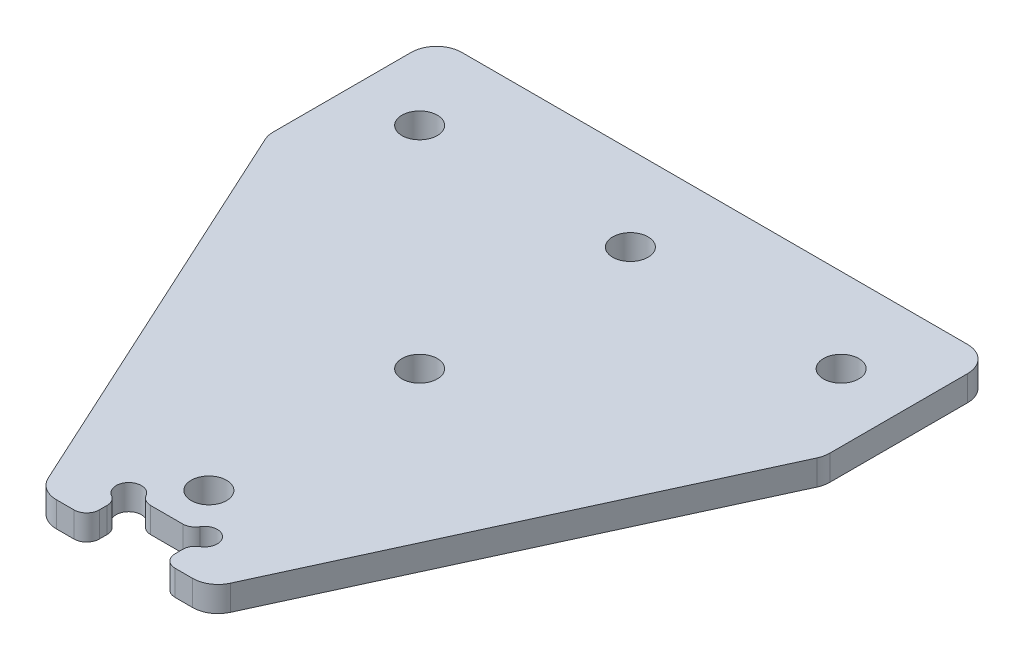
ISO-10303-21;
HEADER;
FILE_DESCRIPTION(('STEP AP214'),'2;1');
FILE_NAME('part.step','',(''),(''),'','','');
FILE_SCHEMA(('AUTOMOTIVE_DESIGN { 1 0 10303 214 1 1 1 1 }'));
ENDSEC;
DATA;
#1=APPLICATION_CONTEXT('core data for automotive mechanical design processes');
#2=APPLICATION_PROTOCOL_DEFINITION('international standard','automotive_design',2000,#1);
#3=PRODUCT_CONTEXT('',#1,'mechanical');
#4=PRODUCT('Part','Part','',(#3));
#5=PRODUCT_RELATED_PRODUCT_CATEGORY('part','',(#4));
#6=PRODUCT_DEFINITION_FORMATION('','',#4);
#7=PRODUCT_DEFINITION_CONTEXT('part definition',#1,'design');
#8=PRODUCT_DEFINITION('design','',#6,#7);
#9=PRODUCT_DEFINITION_SHAPE('','',#8);
#10=(LENGTH_UNIT() NAMED_UNIT(*) SI_UNIT(.MILLI.,.METRE.));
#11=(NAMED_UNIT(*) PLANE_ANGLE_UNIT() SI_UNIT($,.RADIAN.));
#12=(NAMED_UNIT(*) SI_UNIT($,.STERADIAN.) SOLID_ANGLE_UNIT());
#13=UNCERTAINTY_MEASURE_WITH_UNIT(LENGTH_MEASURE(1.E-05),#10,'distance_accuracy_value','');
#14=(GEOMETRIC_REPRESENTATION_CONTEXT(3) GLOBAL_UNCERTAINTY_ASSIGNED_CONTEXT((#13)) GLOBAL_UNIT_ASSIGNED_CONTEXT((#10,
#11,#12)) REPRESENTATION_CONTEXT('',''));
#15=CARTESIAN_POINT('',(0.,0.,0.));
#16=DIRECTION('',(0.,0.,1.));
#17=DIRECTION('',(1.,0.,0.));
#18=AXIS2_PLACEMENT_3D('',#15,#16,#17);
#19=CARTESIAN_POINT('',(0.,3.,60.));
#20=DIRECTION('',(0.,0.,-1.));
#21=DIRECTION('',(-1.,0.,0.));
#22=AXIS2_PLACEMENT_3D('',#19,#20,#21);
#23=PLANE('',#22);
#24=DIRECTION('',(1.,0.,0.));
#25=VECTOR('',#24,1.);
#26=CARTESIAN_POINT('',(0.,0.,60.));
#27=LINE('',#26,#25);
#28=CARTESIAN_POINT('',(-8.07781890260392,0.,60.));
#29=VERTEX_POINT('',#28);
#30=CARTESIAN_POINT('',(-6.,0.,60.));
#31=VERTEX_POINT('',#30);
#32=EDGE_CURVE('E412',#29,#31,#27,.T.);
#33=ORIENTED_EDGE('',*,*,#32,.T.);
#34=DIRECTION('',(0.,1.,0.));
#35=VECTOR('',#34,1.);
#36=CARTESIAN_POINT('',(-6.,3.,60.));
#37=LINE('',#36,#35);
#38=CARTESIAN_POINT('',(-6.,3.,60.));
#39=VERTEX_POINT('',#38);
#40=EDGE_CURVE('E11',#31,#39,#37,.T.);
#41=ORIENTED_EDGE('',*,*,#40,.T.);
#42=DIRECTION('',(1.,0.,0.));
#43=VECTOR('',#42,1.);
#44=CARTESIAN_POINT('',(0.,3.,60.));
#45=LINE('',#44,#43);
#46=CARTESIAN_POINT('',(-8.07781890260392,3.,60.));
#47=VERTEX_POINT('',#46);
#48=EDGE_CURVE('E388',#47,#39,#45,.T.);
#49=ORIENTED_EDGE('',*,*,#48,.F.);
#50=DIRECTION('',(0.,-1.,0.));
#51=VECTOR('',#50,1.);
#52=CARTESIAN_POINT('',(-8.07781890260392,3.,60.));
#53=LINE('',#52,#51);
#54=EDGE_CURVE('E251',#47,#29,#53,.T.);
#55=ORIENTED_EDGE('',*,*,#54,.T.);
#56=EDGE_LOOP('',(#33,#41,#49,#55));
#57=FACE_BOUND('',#56,.T.);
#58=ADVANCED_FACE('F41',(#57),#23,.F.);
#59=CARTESIAN_POINT('',(31.0333443380654,3.,14.2753383955101));
#60=DIRECTION('',(0.908490452678575,0.,0.417905608232144));
#61=DIRECTION('',(0.417905608232144,0.,-0.908490452678575));
#62=AXIS2_PLACEMENT_3D('',#59,#60,#61);
#63=PLANE('',#62);
#64=DIRECTION('',(-0.417905608232144,0.,0.908490452678575));
#65=VECTOR('',#64,1.);
#66=CARTESIAN_POINT('',(31.0333443380654,3.,14.2753383955101));
#67=LINE('',#66,#65);
#68=CARTESIAN_POINT('',(32.7254713580357,3.,10.5968013955745));
#69=VERTEX_POINT('',#68);
#70=CARTESIAN_POINT('',(10.8032902606396,3.,58.2537168246964));
#71=VERTEX_POINT('',#70);
#72=EDGE_CURVE('E373',#69,#71,#67,.T.);
#73=ORIENTED_EDGE('',*,*,#72,.T.);
#74=DIRECTION('',(0.,-1.,0.));
#75=VECTOR('',#74,1.);
#76=CARTESIAN_POINT('',(10.8032902606396,0.,58.2537168246964));
#77=LINE('',#76,#75);
#78=CARTESIAN_POINT('',(10.8032902606396,0.,58.2537168246964));
#79=VERTEX_POINT('',#78);
#80=EDGE_CURVE('E227',#71,#79,#77,.T.);
#81=ORIENTED_EDGE('',*,*,#80,.T.);
#82=DIRECTION('',(-0.417905608232144,0.,0.908490452678575));
#83=VECTOR('',#82,1.);
#84=CARTESIAN_POINT('',(31.0333443380654,0.,14.2753383955101));
#85=LINE('',#84,#83);
#86=CARTESIAN_POINT('',(32.7254713580357,0.,10.5968013955745));
#87=VERTEX_POINT('',#86);
#88=EDGE_CURVE('E210',#87,#79,#85,.T.);
#89=ORIENTED_EDGE('',*,*,#88,.F.);
#90=DIRECTION('',(0.,-1.,0.));
#91=VECTOR('',#90,1.);
#92=CARTESIAN_POINT('',(32.7254713580357,3.,10.5968013955745));
#93=LINE('',#92,#91);
#94=EDGE_CURVE('E224',#87,#69,#93,.F.);
#95=ORIENTED_EDGE('',*,*,#94,.T.);
#96=EDGE_LOOP('',(#73,#81,#89,#95));
#97=FACE_BOUND('',#96,.T.);
#98=ADVANCED_FACE('F223',(#97),#63,.T.);
#99=CARTESIAN_POINT('',(33.,3.,0.));
#100=DIRECTION('',(-1.,0.,0.));
#101=DIRECTION('',(0.,0.,1.));
#102=AXIS2_PLACEMENT_3D('',#99,#100,#101);
#103=PLANE('',#102);
#104=DIRECTION('',(0.,0.,-1.));
#105=VECTOR('',#104,1.);
#106=CARTESIAN_POINT('',(33.,3.,0.));
#107=LINE('',#106,#105);
#108=CARTESIAN_POINT('',(33.,3.,9.34308457087808));
#109=VERTEX_POINT('',#108);
#110=CARTESIAN_POINT('',(33.,3.,-7.));
#111=VERTEX_POINT('',#110);
#112=EDGE_CURVE('E375',#109,#111,#107,.T.);
#113=ORIENTED_EDGE('',*,*,#112,.F.);
#114=DIRECTION('',(0.,-1.,0.));
#115=VECTOR('',#114,1.);
#116=CARTESIAN_POINT('',(33.,0.,9.34308457087808));
#117=LINE('',#116,#115);
#118=CARTESIAN_POINT('',(33.,0.,9.34308457087808));
#119=VERTEX_POINT('',#118);
#120=EDGE_CURVE('E285',#109,#119,#117,.T.);
#121=ORIENTED_EDGE('',*,*,#120,.T.);
#122=DIRECTION('',(0.,0.,-1.));
#123=VECTOR('',#122,1.);
#124=CARTESIAN_POINT('',(33.,0.,0.));
#125=LINE('',#124,#123);
#126=CARTESIAN_POINT('',(33.,0.,-7.));
#127=VERTEX_POINT('',#126);
#128=EDGE_CURVE('E212',#119,#127,#125,.T.);
#129=ORIENTED_EDGE('',*,*,#128,.T.);
#130=DIRECTION('',(0.,-1.,0.));
#131=VECTOR('',#130,1.);
#132=CARTESIAN_POINT('',(33.,3.,-7.));
#133=LINE('',#132,#131);
#134=EDGE_CURVE('E283',#127,#111,#133,.F.);
#135=ORIENTED_EDGE('',*,*,#134,.T.);
#136=EDGE_LOOP('',(#113,#121,#129,#135));
#137=FACE_BOUND('',#136,.T.);
#138=ADVANCED_FACE('F453',(#137),#103,.F.);
#139=CARTESIAN_POINT('',(0.,3.,-10.));
#140=DIRECTION('',(0.,0.,1.));
#141=DIRECTION('',(1.,0.,0.));
#142=AXIS2_PLACEMENT_3D('',#139,#140,#141);
#143=PLANE('',#142);
#144=DIRECTION('',(-1.,0.,0.));
#145=VECTOR('',#144,1.);
#146=CARTESIAN_POINT('',(0.,0.,-10.));
#147=LINE('',#146,#145);
#148=CARTESIAN_POINT('',(30.,0.,-10.));
#149=VERTEX_POINT('',#148);
#150=CARTESIAN_POINT('',(-30.,0.,-10.));
#151=VERTEX_POINT('',#150);
#152=EDGE_CURVE('E402',#149,#151,#147,.T.);
#153=ORIENTED_EDGE('',*,*,#152,.T.);
#154=DIRECTION('',(0.,-1.,0.));
#155=VECTOR('',#154,1.);
#156=CARTESIAN_POINT('',(-30.,3.,-10.));
#157=LINE('',#156,#155);
#158=CARTESIAN_POINT('',(-30.,3.,-10.));
#159=VERTEX_POINT('',#158);
#160=EDGE_CURVE('E281',#151,#159,#157,.F.);
#161=ORIENTED_EDGE('',*,*,#160,.T.);
#162=DIRECTION('',(-1.,0.,0.));
#163=VECTOR('',#162,1.);
#164=CARTESIAN_POINT('',(0.,3.,-10.));
#165=LINE('',#164,#163);
#166=CARTESIAN_POINT('',(30.,3.,-10.));
#167=VERTEX_POINT('',#166);
#168=EDGE_CURVE('E378',#167,#159,#165,.T.);
#169=ORIENTED_EDGE('',*,*,#168,.F.);
#170=DIRECTION('',(0.,-1.,0.));
#171=VECTOR('',#170,1.);
#172=CARTESIAN_POINT('',(30.,3.,-10.));
#173=LINE('',#172,#171);
#174=EDGE_CURVE('E278',#167,#149,#173,.T.);
#175=ORIENTED_EDGE('',*,*,#174,.T.);
#176=EDGE_LOOP('',(#153,#161,#169,#175));
#177=FACE_BOUND('',#176,.T.);
#178=ADVANCED_FACE('F466',(#177),#143,.F.);
#179=CARTESIAN_POINT('',(-33.,3.,0.));
#180=DIRECTION('',(1.,0.,0.));
#181=DIRECTION('',(0.,0.,-1.));
#182=AXIS2_PLACEMENT_3D('',#179,#180,#181);
#183=PLANE('',#182);
#184=DIRECTION('',(0.,0.,1.));
#185=VECTOR('',#184,1.);
#186=CARTESIAN_POINT('',(-33.,0.,0.));
#187=LINE('',#186,#185);
#188=CARTESIAN_POINT('',(-33.,0.,-7.));
#189=VERTEX_POINT('',#188);
#190=CARTESIAN_POINT('',(-33.,0.,9.34308457087808));
#191=VERTEX_POINT('',#190);
#192=EDGE_CURVE('E405',#189,#191,#187,.T.);
#193=ORIENTED_EDGE('',*,*,#192,.T.);
#194=DIRECTION('',(0.,-1.,0.));
#195=VECTOR('',#194,1.);
#196=CARTESIAN_POINT('',(-33.,3.,9.34308457087808));
#197=LINE('',#196,#195);
#198=CARTESIAN_POINT('',(-33.,3.,9.34308457087808));
#199=VERTEX_POINT('',#198);
#200=EDGE_CURVE('E276',#191,#199,#197,.F.);
#201=ORIENTED_EDGE('',*,*,#200,.T.);
#202=DIRECTION('',(0.,0.,1.));
#203=VECTOR('',#202,1.);
#204=CARTESIAN_POINT('',(-33.,3.,0.));
#205=LINE('',#204,#203);
#206=CARTESIAN_POINT('',(-33.,3.,-7.));
#207=VERTEX_POINT('',#206);
#208=EDGE_CURVE('E381',#207,#199,#205,.T.);
#209=ORIENTED_EDGE('',*,*,#208,.F.);
#210=DIRECTION('',(0.,-1.,0.));
#211=VECTOR('',#210,1.);
#212=CARTESIAN_POINT('',(-33.,3.,-7.));
#213=LINE('',#212,#211);
#214=EDGE_CURVE('E273',#207,#189,#213,.T.);
#215=ORIENTED_EDGE('',*,*,#214,.T.);
#216=EDGE_LOOP('',(#193,#201,#209,#215));
#217=FACE_BOUND('',#216,.T.);
#218=ADVANCED_FACE('F462',(#217),#183,.F.);
#219=CARTESIAN_POINT('',(-31.0333443380654,3.,14.2753383955101));
#220=DIRECTION('',(0.908490452678575,0.,-0.417905608232144));
#221=DIRECTION('',(-0.417905608232144,0.,-0.908490452678575));
#222=AXIS2_PLACEMENT_3D('',#219,#220,#221);
#223=PLANE('',#222);
#224=DIRECTION('',(0.417905608232144,0.,0.908490452678575));
#225=VECTOR('',#224,1.);
#226=CARTESIAN_POINT('',(-31.0333443380654,0.,14.2753383955101));
#227=LINE('',#226,#225);
#228=CARTESIAN_POINT('',(-32.7254713580357,0.,10.5968013955745));
#229=VERTEX_POINT('',#228);
#230=CARTESIAN_POINT('',(-10.8032902606396,0.,58.2537168246964));
#231=VERTEX_POINT('',#230);
#232=EDGE_CURVE('E408',#229,#231,#227,.T.);
#233=ORIENTED_EDGE('',*,*,#232,.T.);
#234=DIRECTION('',(0.,-1.,0.));
#235=VECTOR('',#234,1.);
#236=CARTESIAN_POINT('',(-10.8032902606396,3.,58.2537168246964));
#237=LINE('',#236,#235);
#238=CARTESIAN_POINT('',(-10.8032902606396,3.,58.2537168246964));
#239=VERTEX_POINT('',#238);
#240=EDGE_CURVE('E271',#231,#239,#237,.F.);
#241=ORIENTED_EDGE('',*,*,#240,.T.);
#242=DIRECTION('',(0.417905608232144,0.,0.908490452678575));
#243=VECTOR('',#242,1.);
#244=CARTESIAN_POINT('',(-31.0333443380654,3.,14.2753383955101));
#245=LINE('',#244,#243);
#246=CARTESIAN_POINT('',(-32.7254713580357,3.,10.5968013955745));
#247=VERTEX_POINT('',#246);
#248=EDGE_CURVE('E384',#247,#239,#245,.T.);
#249=ORIENTED_EDGE('',*,*,#248,.F.);
#250=DIRECTION('',(0.,-1.,0.));
#251=VECTOR('',#250,1.);
#252=CARTESIAN_POINT('',(-32.7254713580357,3.,10.5968013955745));
#253=LINE('',#252,#251);
#254=EDGE_CURVE('E268',#247,#229,#253,.T.);
#255=ORIENTED_EDGE('',*,*,#254,.T.);
#256=EDGE_LOOP('',(#233,#241,#249,#255));
#257=FACE_BOUND('',#256,.T.);
#258=ADVANCED_FACE('F458',(#257),#223,.F.);
#259=CARTESIAN_POINT('',(25.,3.,0.));
#260=DIRECTION('',(0.,-1.,0.));
#261=DIRECTION('',(0.,0.,-1.));
#262=AXIS2_PLACEMENT_3D('',#259,#260,#261);
#263=CYLINDRICAL_SURFACE('',#262,2.1);
#264=CARTESIAN_POINT('',(25.,3.,0.));
#265=DIRECTION('',(0.,1.,0.));
#266=DIRECTION('',(0.,0.,1.));
#267=AXIS2_PLACEMENT_3D('',#264,#265,#266);
#268=CIRCLE('',#267,2.1);
#269=CARTESIAN_POINT('',(25.,3.,2.1));
#270=VERTEX_POINT('',#269);
#271=EDGE_CURVE('E237',#270,#270,#268,.T.);
#272=ORIENTED_EDGE('',*,*,#271,.T.);
#273=EDGE_LOOP('',(#272));
#274=FACE_BOUND('',#273,.T.);
#275=CARTESIAN_POINT('',(25.,0.,0.));
#276=DIRECTION('',(0.,1.,0.));
#277=DIRECTION('',(0.,0.,1.));
#278=AXIS2_PLACEMENT_3D('',#275,#276,#277);
#279=CIRCLE('',#278,2.1);
#280=CARTESIAN_POINT('',(25.,0.,2.1));
#281=VERTEX_POINT('',#280);
#282=EDGE_CURVE('E423',#281,#281,#279,.T.);
#283=ORIENTED_EDGE('',*,*,#282,.F.);
#284=EDGE_LOOP('',(#283));
#285=FACE_BOUND('',#284,.T.);
#286=ADVANCED_FACE('F461',(#274,#285),#263,.F.);
#287=CARTESIAN_POINT('',(-25.,3.,0.));
#288=DIRECTION('',(0.,-1.,0.));
#289=DIRECTION('',(0.,0.,-1.));
#290=AXIS2_PLACEMENT_3D('',#287,#288,#289);
#291=CYLINDRICAL_SURFACE('',#290,2.1);
#292=CARTESIAN_POINT('',(-25.,3.,0.));
#293=DIRECTION('',(0.,1.,0.));
#294=DIRECTION('',(0.,0.,1.));
#295=AXIS2_PLACEMENT_3D('',#292,#293,#294);
#296=CIRCLE('',#295,2.1);
#297=CARTESIAN_POINT('',(-25.,3.,2.1));
#298=VERTEX_POINT('',#297);
#299=EDGE_CURVE('E396',#298,#298,#296,.T.);
#300=ORIENTED_EDGE('',*,*,#299,.T.);
#301=EDGE_LOOP('',(#300));
#302=FACE_BOUND('',#301,.T.);
#303=CARTESIAN_POINT('',(-25.,0.,0.));
#304=DIRECTION('',(0.,1.,0.));
#305=DIRECTION('',(0.,0.,1.));
#306=AXIS2_PLACEMENT_3D('',#303,#304,#305);
#307=CIRCLE('',#306,2.1);
#308=CARTESIAN_POINT('',(-25.,0.,2.1));
#309=VERTEX_POINT('',#308);
#310=EDGE_CURVE('E421',#309,#309,#307,.T.);
#311=ORIENTED_EDGE('',*,*,#310,.F.);
#312=EDGE_LOOP('',(#311));
#313=FACE_BOUND('',#312,.T.);
#314=ADVANCED_FACE('F676',(#302,#313),#291,.F.);
#315=CARTESIAN_POINT('',(0.,3.,25.));
#316=DIRECTION('',(0.,-1.,0.));
#317=DIRECTION('',(0.,0.,-1.));
#318=AXIS2_PLACEMENT_3D('',#315,#316,#317);
#319=CYLINDRICAL_SURFACE('',#318,2.1);
#320=CARTESIAN_POINT('',(0.,3.,25.));
#321=DIRECTION('',(0.,1.,0.));
#322=DIRECTION('',(0.,0.,1.));
#323=AXIS2_PLACEMENT_3D('',#320,#321,#322);
#324=CIRCLE('',#323,2.1);
#325=CARTESIAN_POINT('',(0.,3.,27.1));
#326=VERTEX_POINT('',#325);
#327=EDGE_CURVE('E393',#326,#326,#324,.T.);
#328=ORIENTED_EDGE('',*,*,#327,.T.);
#329=EDGE_LOOP('',(#328));
#330=FACE_BOUND('',#329,.T.);
#331=CARTESIAN_POINT('',(0.,0.,25.));
#332=DIRECTION('',(0.,1.,0.));
#333=DIRECTION('',(0.,0.,1.));
#334=AXIS2_PLACEMENT_3D('',#331,#332,#333);
#335=CIRCLE('',#334,2.1);
#336=CARTESIAN_POINT('',(0.,0.,27.1));
#337=VERTEX_POINT('',#336);
#338=EDGE_CURVE('E418',#337,#337,#335,.T.);
#339=ORIENTED_EDGE('',*,*,#338,.F.);
#340=EDGE_LOOP('',(#339));
#341=FACE_BOUND('',#340,.T.);
#342=ADVANCED_FACE('F683',(#330,#341),#319,.F.);
#343=CARTESIAN_POINT('',(0.,3.,50.));
#344=DIRECTION('',(0.,-1.,0.));
#345=DIRECTION('',(0.,0.,-1.));
#346=AXIS2_PLACEMENT_3D('',#343,#344,#345);
#347=CYLINDRICAL_SURFACE('',#346,2.1);
#348=CARTESIAN_POINT('',(0.,3.,50.));
#349=DIRECTION('',(0.,1.,0.));
#350=DIRECTION('',(0.,0.,1.));
#351=AXIS2_PLACEMENT_3D('',#348,#349,#350);
#352=CIRCLE('',#351,2.1);
#353=CARTESIAN_POINT('',(0.,3.,52.1));
#354=VERTEX_POINT('',#353);
#355=EDGE_CURVE('E390',#354,#354,#352,.T.);
#356=ORIENTED_EDGE('',*,*,#355,.T.);
#357=EDGE_LOOP('',(#356));
#358=FACE_BOUND('',#357,.T.);
#359=CARTESIAN_POINT('',(0.,0.,50.));
#360=DIRECTION('',(0.,1.,0.));
#361=DIRECTION('',(0.,0.,1.));
#362=AXIS2_PLACEMENT_3D('',#359,#360,#361);
#363=CIRCLE('',#362,2.1);
#364=CARTESIAN_POINT('',(0.,0.,52.1));
#365=VERTEX_POINT('',#364);
#366=EDGE_CURVE('E415',#365,#365,#363,.T.);
#367=ORIENTED_EDGE('',*,*,#366,.F.);
#368=EDGE_LOOP('',(#367));
#369=FACE_BOUND('',#368,.T.);
#370=ADVANCED_FACE('F443',(#358,#369),#347,.F.);
#371=CARTESIAN_POINT('',(6.,3.,60.));
#372=VERTEX_POINT('',#371);
#373=CARTESIAN_POINT('',(8.07781890260393,3.,60.));
#374=VERTEX_POINT('',#373);
#375=EDGE_CURVE('E387',#372,#374,#45,.T.);
#376=ORIENTED_EDGE('',*,*,#375,.F.);
#377=DIRECTION('',(0.,1.,0.));
#378=VECTOR('',#377,1.);
#379=CARTESIAN_POINT('',(6.,3.,60.));
#380=LINE('',#379,#378);
#381=CARTESIAN_POINT('',(6.,0.,60.));
#382=VERTEX_POINT('',#381);
#383=EDGE_CURVE('E324',#372,#382,#380,.F.);
#384=ORIENTED_EDGE('',*,*,#383,.T.);
#385=CARTESIAN_POINT('',(8.07781890260393,0.,60.));
#386=VERTEX_POINT('',#385);
#387=EDGE_CURVE('E411',#382,#386,#27,.T.);
#388=ORIENTED_EDGE('',*,*,#387,.T.);
#389=DIRECTION('',(0.,-1.,0.));
#390=VECTOR('',#389,1.);
#391=CARTESIAN_POINT('',(8.07781890260393,3.,60.));
#392=LINE('',#391,#390);
#393=EDGE_CURVE('E254',#386,#374,#392,.F.);
#394=ORIENTED_EDGE('',*,*,#393,.T.);
#395=EDGE_LOOP('',(#376,#384,#388,#394));
#396=FACE_BOUND('',#395,.T.);
#397=ADVANCED_FACE('F433',(#396),#23,.F.);
#398=CARTESIAN_POINT('',(0.,3.,0.));
#399=DIRECTION('',(0.,-1.,0.));
#400=DIRECTION('',(0.,0.,-1.));
#401=AXIS2_PLACEMENT_3D('',#398,#399,#400);
#402=CYLINDRICAL_SURFACE('',#401,2.1);
#403=CARTESIAN_POINT('',(0.,3.,0.));
#404=DIRECTION('',(0.,1.,0.));
#405=DIRECTION('',(0.,0.,1.));
#406=AXIS2_PLACEMENT_3D('',#403,#404,#405);
#407=CIRCLE('',#406,2.1);
#408=CARTESIAN_POINT('',(0.,3.,2.1));
#409=VERTEX_POINT('',#408);
#410=EDGE_CURVE('E233',#409,#409,#407,.T.);
#411=ORIENTED_EDGE('',*,*,#410,.T.);
#412=EDGE_LOOP('',(#411));
#413=FACE_BOUND('',#412,.T.);
#414=CARTESIAN_POINT('',(0.,0.,0.));
#415=DIRECTION('',(0.,1.,0.));
#416=DIRECTION('',(0.,0.,1.));
#417=AXIS2_PLACEMENT_3D('',#414,#415,#416);
#418=CIRCLE('',#417,2.1);
#419=CARTESIAN_POINT('',(0.,0.,2.1));
#420=VERTEX_POINT('',#419);
#421=EDGE_CURVE('E240',#420,#420,#418,.T.);
#422=ORIENTED_EDGE('',*,*,#421,.F.);
#423=EDGE_LOOP('',(#422));
#424=FACE_BOUND('',#423,.T.);
#425=ADVANCED_FACE('F431',(#413,#424),#402,.F.);
#426=CARTESIAN_POINT('',(0.,3.,0.));
#427=DIRECTION('',(0.,1.,0.));
#428=DIRECTION('',(0.,0.,1.));
#429=AXIS2_PLACEMENT_3D('',#426,#427,#428);
#430=PLANE('',#429);
#431=DIRECTION('',(-1.,0.,0.));
#432=VECTOR('',#431,1.);
#433=CARTESIAN_POINT('',(-4.5,3.,55.));
#434=LINE('',#433,#432);
#435=CARTESIAN_POINT('',(1.90192378864668,3.,55.));
#436=VERTEX_POINT('',#435);
#437=CARTESIAN_POINT('',(-1.90192378864668,3.,55.));
#438=VERTEX_POINT('',#437);
#439=EDGE_CURVE('E366',#436,#438,#434,.T.);
#440=ORIENTED_EDGE('',*,*,#439,.F.);
#441=CARTESIAN_POINT('',(1.90192378864668,3.,53.5));
#442=DIRECTION('',(0.,1.,0.));
#443=DIRECTION('',(0.,0.,1.));
#444=AXIS2_PLACEMENT_3D('',#441,#442,#443);
#445=CIRCLE('',#444,1.5);
#446=CARTESIAN_POINT('',(3.20096189432334,3.,54.25));
#447=VERTEX_POINT('',#446);
#448=EDGE_CURVE('E303',#436,#447,#445,.T.);
#449=ORIENTED_EDGE('',*,*,#448,.T.);
#450=CARTESIAN_POINT('',(4.5,3.,55.));
#451=DIRECTION('',(0.,1.,0.));
#452=DIRECTION('',(0.,0.,1.));
#453=AXIS2_PLACEMENT_3D('',#450,#451,#452);
#454=CIRCLE('',#453,1.5);
#455=CARTESIAN_POINT('',(5.25,3.,56.2990381056767));
#456=VERTEX_POINT('',#455);
#457=EDGE_CURVE('E524',#456,#447,#454,.T.);
#458=ORIENTED_EDGE('',*,*,#457,.F.);
#459=CARTESIAN_POINT('',(6.,3.,57.5980762113533));
#460=DIRECTION('',(0.,1.,0.));
#461=DIRECTION('',(0.,0.,1.));
#462=AXIS2_PLACEMENT_3D('',#459,#460,#461);
#463=CIRCLE('',#462,1.5);
#464=CARTESIAN_POINT('',(4.5,3.,57.5980762113533));
#465=VERTEX_POINT('',#464);
#466=EDGE_CURVE('E301',#456,#465,#463,.T.);
#467=ORIENTED_EDGE('',*,*,#466,.T.);
#468=DIRECTION('',(0.,0.,-1.));
#469=VECTOR('',#468,1.);
#470=CARTESIAN_POINT('',(4.5,3.,60.));
#471=LINE('',#470,#469);
#472=CARTESIAN_POINT('',(4.5,3.,58.5));
#473=VERTEX_POINT('',#472);
#474=EDGE_CURVE('E363',#473,#465,#471,.T.);
#475=ORIENTED_EDGE('',*,*,#474,.F.);
#476=CARTESIAN_POINT('',(6.,3.,58.5));
#477=DIRECTION('',(0.,1.,0.));
#478=DIRECTION('',(0.,0.,1.));
#479=AXIS2_PLACEMENT_3D('',#476,#477,#478);
#480=CIRCLE('',#479,1.5);
#481=EDGE_CURVE('E299',#473,#372,#480,.T.);
#482=ORIENTED_EDGE('',*,*,#481,.T.);
#483=ORIENTED_EDGE('',*,*,#375,.T.);
#484=CARTESIAN_POINT('',(8.07781890260393,3.,57.));
#485=DIRECTION('',(0.,1.,0.));
#486=DIRECTION('',(0.,0.,1.));
#487=AXIS2_PLACEMENT_3D('',#484,#485,#486);
#488=CIRCLE('',#487,3.);
#489=EDGE_CURVE('E266',#374,#71,#488,.T.);
#490=ORIENTED_EDGE('',*,*,#489,.T.);
#491=ORIENTED_EDGE('',*,*,#72,.F.);
#492=CARTESIAN_POINT('',(30.,3.,9.34308457087808));
#493=DIRECTION('',(0.,1.,0.));
#494=DIRECTION('',(0.,0.,1.));
#495=AXIS2_PLACEMENT_3D('',#492,#493,#494);
#496=CIRCLE('',#495,3.);
#497=EDGE_CURVE('E232',#69,#109,#496,.T.);
#498=ORIENTED_EDGE('',*,*,#497,.T.);
#499=ORIENTED_EDGE('',*,*,#112,.T.);
#500=CARTESIAN_POINT('',(30.,3.,-7.));
#501=DIRECTION('',(0.,1.,0.));
#502=DIRECTION('',(0.,0.,1.));
#503=AXIS2_PLACEMENT_3D('',#500,#501,#502);
#504=CIRCLE('',#503,3.);
#505=EDGE_CURVE('E257',#111,#167,#504,.T.);
#506=ORIENTED_EDGE('',*,*,#505,.T.);
#507=ORIENTED_EDGE('',*,*,#168,.T.);
#508=CARTESIAN_POINT('',(-30.,3.,-7.));
#509=DIRECTION('',(0.,1.,0.));
#510=DIRECTION('',(0.,0.,1.));
#511=AXIS2_PLACEMENT_3D('',#508,#509,#510);
#512=CIRCLE('',#511,3.);
#513=EDGE_CURVE('E260',#159,#207,#512,.T.);
#514=ORIENTED_EDGE('',*,*,#513,.T.);
#515=ORIENTED_EDGE('',*,*,#208,.T.);
#516=CARTESIAN_POINT('',(-30.,3.,9.34308457087808));
#517=DIRECTION('',(0.,1.,0.));
#518=DIRECTION('',(0.,0.,1.));
#519=AXIS2_PLACEMENT_3D('',#516,#517,#518);
#520=CIRCLE('',#519,3.);
#521=EDGE_CURVE('E262',#199,#247,#520,.T.);
#522=ORIENTED_EDGE('',*,*,#521,.T.);
#523=ORIENTED_EDGE('',*,*,#248,.T.);
#524=CARTESIAN_POINT('',(-8.07781890260392,3.,57.));
#525=DIRECTION('',(0.,1.,0.));
#526=DIRECTION('',(0.,0.,1.));
#527=AXIS2_PLACEMENT_3D('',#524,#525,#526);
#528=CIRCLE('',#527,3.);
#529=EDGE_CURVE('E264',#239,#47,#528,.T.);
#530=ORIENTED_EDGE('',*,*,#529,.T.);
#531=ORIENTED_EDGE('',*,*,#48,.T.);
#532=CARTESIAN_POINT('',(-6.,3.,58.5));
#533=DIRECTION('',(0.,1.,0.));
#534=DIRECTION('',(0.,0.,1.));
#535=AXIS2_PLACEMENT_3D('',#532,#533,#534);
#536=CIRCLE('',#535,1.5);
#537=CARTESIAN_POINT('',(-4.5,3.,58.5));
#538=VERTEX_POINT('',#537);
#539=EDGE_CURVE('E293',#39,#538,#536,.T.);
#540=ORIENTED_EDGE('',*,*,#539,.T.);
#541=DIRECTION('',(0.,0.,1.));
#542=VECTOR('',#541,1.);
#543=CARTESIAN_POINT('',(-4.5,3.,60.));
#544=LINE('',#543,#542);
#545=CARTESIAN_POINT('',(-4.5,3.,57.5980762113533));
#546=VERTEX_POINT('',#545);
#547=EDGE_CURVE('E347',#546,#538,#544,.T.);
#548=ORIENTED_EDGE('',*,*,#547,.F.);
#549=CARTESIAN_POINT('',(-6.,3.,57.5980762113533));
#550=DIRECTION('',(0.,1.,0.));
#551=DIRECTION('',(0.,0.,1.));
#552=AXIS2_PLACEMENT_3D('',#549,#550,#551);
#553=CIRCLE('',#552,1.5);
#554=CARTESIAN_POINT('',(-5.25,3.,56.2990381056767));
#555=VERTEX_POINT('',#554);
#556=EDGE_CURVE('E297',#546,#555,#553,.T.);
#557=ORIENTED_EDGE('',*,*,#556,.T.);
#558=CARTESIAN_POINT('',(-4.5,3.,55.));
#559=DIRECTION('',(0.,1.,0.));
#560=DIRECTION('',(0.,0.,1.));
#561=AXIS2_PLACEMENT_3D('',#558,#559,#560);
#562=CIRCLE('',#561,1.5);
#563=CARTESIAN_POINT('',(-3.20096189432334,3.,54.25));
#564=VERTEX_POINT('',#563);
#565=EDGE_CURVE('E341',#564,#555,#562,.T.);
#566=ORIENTED_EDGE('',*,*,#565,.F.);
#567=CARTESIAN_POINT('',(-1.90192378864668,3.,53.5));
#568=DIRECTION('',(0.,1.,0.));
#569=DIRECTION('',(0.,0.,1.));
#570=AXIS2_PLACEMENT_3D('',#567,#568,#569);
#571=CIRCLE('',#570,1.5);
#572=EDGE_CURVE('E295',#564,#438,#571,.T.);
#573=ORIENTED_EDGE('',*,*,#572,.T.);
#574=EDGE_LOOP('',(#440,#449,#458,#467,#475,#482,#483,#490,#491,#498,#499,#506,#507,#514,#515,
#522,#523,#530,#531,#540,#548,#557,#566,#573));
#575=FACE_BOUND('',#574,.T.);
#576=ORIENTED_EDGE('',*,*,#355,.F.);
#577=EDGE_LOOP('',(#576));
#578=FACE_BOUND('',#577,.T.);
#579=ORIENTED_EDGE('',*,*,#327,.F.);
#580=EDGE_LOOP('',(#579));
#581=FACE_BOUND('',#580,.T.);
#582=ORIENTED_EDGE('',*,*,#299,.F.);
#583=EDGE_LOOP('',(#582));
#584=FACE_BOUND('',#583,.T.);
#585=ORIENTED_EDGE('',*,*,#271,.F.);
#586=EDGE_LOOP('',(#585));
#587=FACE_BOUND('',#586,.T.);
#588=ORIENTED_EDGE('',*,*,#410,.F.);
#589=EDGE_LOOP('',(#588));
#590=FACE_BOUND('',#589,.T.);
#591=ADVANCED_FACE('F360',(#575,#578,#581,#584,#587,#590),#430,.T.);
#592=CARTESIAN_POINT('',(0.,0.,0.));
#593=DIRECTION('',(0.,1.,0.));
#594=DIRECTION('',(0.,0.,1.));
#595=AXIS2_PLACEMENT_3D('',#592,#593,#594);
#596=PLANE('',#595);
#597=CARTESIAN_POINT('',(4.5,0.,55.));
#598=DIRECTION('',(0.,1.,0.));
#599=DIRECTION('',(0.,0.,1.));
#600=AXIS2_PLACEMENT_3D('',#597,#598,#599);
#601=CIRCLE('',#600,1.5);
#602=CARTESIAN_POINT('',(5.25,0.,56.2990381056767));
#603=VERTEX_POINT('',#602);
#604=CARTESIAN_POINT('',(3.20096189432334,0.,54.25));
#605=VERTEX_POINT('',#604);
#606=EDGE_CURVE('E348',#603,#605,#601,.T.);
#607=ORIENTED_EDGE('',*,*,#606,.T.);
#608=CARTESIAN_POINT('',(1.90192378864668,0.,53.5));
#609=DIRECTION('',(0.,1.,0.));
#610=DIRECTION('',(0.,0.,1.));
#611=AXIS2_PLACEMENT_3D('',#608,#609,#610);
#612=CIRCLE('',#611,1.5);
#613=CARTESIAN_POINT('',(1.90192378864668,0.,55.));
#614=VERTEX_POINT('',#613);
#615=EDGE_CURVE('E317',#605,#614,#612,.F.);
#616=ORIENTED_EDGE('',*,*,#615,.T.);
#617=DIRECTION('',(-1.,0.,0.));
#618=VECTOR('',#617,1.);
#619=CARTESIAN_POINT('',(-4.5,0.,55.));
#620=LINE('',#619,#618);
#621=CARTESIAN_POINT('',(-1.90192378864668,0.,55.));
#622=VERTEX_POINT('',#621);
#623=EDGE_CURVE('E228',#614,#622,#620,.T.);
#624=ORIENTED_EDGE('',*,*,#623,.T.);
#625=CARTESIAN_POINT('',(-1.90192378864668,0.,53.5));
#626=DIRECTION('',(0.,1.,0.));
#627=DIRECTION('',(0.,0.,1.));
#628=AXIS2_PLACEMENT_3D('',#625,#626,#627);
#629=CIRCLE('',#628,1.5);
#630=CARTESIAN_POINT('',(-3.20096189432334,0.,54.25));
#631=VERTEX_POINT('',#630);
#632=EDGE_CURVE('E311',#622,#631,#629,.F.);
#633=ORIENTED_EDGE('',*,*,#632,.T.);
#634=CARTESIAN_POINT('',(-4.5,0.,55.));
#635=DIRECTION('',(0.,1.,0.));
#636=DIRECTION('',(0.,0.,1.));
#637=AXIS2_PLACEMENT_3D('',#634,#635,#636);
#638=CIRCLE('',#637,1.5);
#639=CARTESIAN_POINT('',(-5.25,0.,56.2990381056767));
#640=VERTEX_POINT('',#639);
#641=EDGE_CURVE('E338',#631,#640,#638,.T.);
#642=ORIENTED_EDGE('',*,*,#641,.T.);
#643=CARTESIAN_POINT('',(-6.,0.,57.5980762113533));
#644=DIRECTION('',(0.,1.,0.));
#645=DIRECTION('',(0.,0.,1.));
#646=AXIS2_PLACEMENT_3D('',#643,#644,#645);
#647=CIRCLE('',#646,1.5);
#648=CARTESIAN_POINT('',(-4.5,0.,57.5980762113533));
#649=VERTEX_POINT('',#648);
#650=EDGE_CURVE('E313',#640,#649,#647,.F.);
#651=ORIENTED_EDGE('',*,*,#650,.T.);
#652=DIRECTION('',(0.,0.,1.));
#653=VECTOR('',#652,1.);
#654=CARTESIAN_POINT('',(-4.5,0.,60.));
#655=LINE('',#654,#653);
#656=CARTESIAN_POINT('',(-4.5,0.,58.5));
#657=VERTEX_POINT('',#656);
#658=EDGE_CURVE('E357',#649,#657,#655,.T.);
#659=ORIENTED_EDGE('',*,*,#658,.T.);
#660=CARTESIAN_POINT('',(-6.,0.,58.5));
#661=DIRECTION('',(0.,1.,0.));
#662=DIRECTION('',(0.,0.,1.));
#663=AXIS2_PLACEMENT_3D('',#660,#661,#662);
#664=CIRCLE('',#663,1.5);
#665=EDGE_CURVE('E309',#657,#31,#664,.F.);
#666=ORIENTED_EDGE('',*,*,#665,.T.);
#667=ORIENTED_EDGE('',*,*,#32,.F.);
#668=CARTESIAN_POINT('',(-8.07781890260392,0.,57.));
#669=DIRECTION('',(0.,1.,0.));
#670=DIRECTION('',(0.,0.,1.));
#671=AXIS2_PLACEMENT_3D('',#668,#669,#670);
#672=CIRCLE('',#671,3.);
#673=EDGE_CURVE('E247',#29,#231,#672,.F.);
#674=ORIENTED_EDGE('',*,*,#673,.T.);
#675=ORIENTED_EDGE('',*,*,#232,.F.);
#676=CARTESIAN_POINT('',(-30.,0.,9.34308457087808));
#677=DIRECTION('',(0.,1.,0.));
#678=DIRECTION('',(0.,0.,1.));
#679=AXIS2_PLACEMENT_3D('',#676,#677,#678);
#680=CIRCLE('',#679,3.);
#681=EDGE_CURVE('E245',#229,#191,#680,.F.);
#682=ORIENTED_EDGE('',*,*,#681,.T.);
#683=ORIENTED_EDGE('',*,*,#192,.F.);
#684=CARTESIAN_POINT('',(-30.,0.,-7.));
#685=DIRECTION('',(0.,1.,0.));
#686=DIRECTION('',(0.,0.,1.));
#687=AXIS2_PLACEMENT_3D('',#684,#685,#686);
#688=CIRCLE('',#687,3.);
#689=EDGE_CURVE('E217',#189,#151,#688,.F.);
#690=ORIENTED_EDGE('',*,*,#689,.T.);
#691=ORIENTED_EDGE('',*,*,#152,.F.);
#692=CARTESIAN_POINT('',(30.,0.,-7.));
#693=DIRECTION('',(0.,1.,0.));
#694=DIRECTION('',(0.,0.,1.));
#695=AXIS2_PLACEMENT_3D('',#692,#693,#694);
#696=CIRCLE('',#695,3.);
#697=EDGE_CURVE('E218',#149,#127,#696,.F.);
#698=ORIENTED_EDGE('',*,*,#697,.T.);
#699=ORIENTED_EDGE('',*,*,#128,.F.);
#700=CARTESIAN_POINT('',(30.,0.,9.34308457087808));
#701=DIRECTION('',(0.,1.,0.));
#702=DIRECTION('',(0.,0.,1.));
#703=AXIS2_PLACEMENT_3D('',#700,#701,#702);
#704=CIRCLE('',#703,3.);
#705=EDGE_CURVE('E204',#119,#87,#704,.F.);
#706=ORIENTED_EDGE('',*,*,#705,.T.);
#707=ORIENTED_EDGE('',*,*,#88,.T.);
#708=CARTESIAN_POINT('',(8.07781890260393,0.,57.));
#709=DIRECTION('',(0.,1.,0.));
#710=DIRECTION('',(0.,0.,1.));
#711=AXIS2_PLACEMENT_3D('',#708,#709,#710);
#712=CIRCLE('',#711,3.);
#713=EDGE_CURVE('E249',#79,#386,#712,.F.);
#714=ORIENTED_EDGE('',*,*,#713,.T.);
#715=ORIENTED_EDGE('',*,*,#387,.F.);
#716=CARTESIAN_POINT('',(6.,0.,58.5));
#717=DIRECTION('',(0.,1.,0.));
#718=DIRECTION('',(0.,0.,1.));
#719=AXIS2_PLACEMENT_3D('',#716,#717,#718);
#720=CIRCLE('',#719,1.5);
#721=CARTESIAN_POINT('',(4.5,0.,58.5));
#722=VERTEX_POINT('',#721);
#723=EDGE_CURVE('E64',#382,#722,#720,.F.);
#724=ORIENTED_EDGE('',*,*,#723,.T.);
#725=DIRECTION('',(0.,0.,-1.));
#726=VECTOR('',#725,1.);
#727=CARTESIAN_POINT('',(4.5,0.,60.));
#728=LINE('',#727,#726);
#729=CARTESIAN_POINT('',(4.5,0.,57.5980762113533));
#730=VERTEX_POINT('',#729);
#731=EDGE_CURVE('E533',#722,#730,#728,.T.);
#732=ORIENTED_EDGE('',*,*,#731,.T.);
#733=CARTESIAN_POINT('',(6.,0.,57.5980762113533));
#734=DIRECTION('',(0.,1.,0.));
#735=DIRECTION('',(0.,0.,1.));
#736=AXIS2_PLACEMENT_3D('',#733,#734,#735);
#737=CIRCLE('',#736,1.5);
#738=EDGE_CURVE('E56',#730,#603,#737,.F.);
#739=ORIENTED_EDGE('',*,*,#738,.T.);
#740=EDGE_LOOP('',(#607,#616,#624,#633,#642,#651,#659,#666,#667,#674,#675,#682,#683,#690,#691,
#698,#699,#706,#707,#714,#715,#724,#732,#739));
#741=FACE_BOUND('',#740,.T.);
#742=ORIENTED_EDGE('',*,*,#366,.T.);
#743=EDGE_LOOP('',(#742));
#744=FACE_BOUND('',#743,.T.);
#745=ORIENTED_EDGE('',*,*,#338,.T.);
#746=EDGE_LOOP('',(#745));
#747=FACE_BOUND('',#746,.T.);
#748=ORIENTED_EDGE('',*,*,#310,.T.);
#749=EDGE_LOOP('',(#748));
#750=FACE_BOUND('',#749,.T.);
#751=ORIENTED_EDGE('',*,*,#282,.T.);
#752=EDGE_LOOP('',(#751));
#753=FACE_BOUND('',#752,.T.);
#754=ORIENTED_EDGE('',*,*,#421,.T.);
#755=EDGE_LOOP('',(#754));
#756=FACE_BOUND('',#755,.T.);
#757=ADVANCED_FACE('F207',(#741,#744,#747,#750,#753,#756),#596,.F.);
#758=CARTESIAN_POINT('',(8.07781890260393,3.,57.));
#759=DIRECTION('',(0.,1.,0.));
#760=DIRECTION('',(0.,0.,1.));
#761=AXIS2_PLACEMENT_3D('',#758,#759,#760);
#762=CYLINDRICAL_SURFACE('',#761,3.);
#763=ORIENTED_EDGE('',*,*,#489,.F.);
#764=ORIENTED_EDGE('',*,*,#393,.F.);
#765=ORIENTED_EDGE('',*,*,#713,.F.);
#766=ORIENTED_EDGE('',*,*,#80,.F.);
#767=EDGE_LOOP('',(#763,#764,#765,#766));
#768=FACE_BOUND('',#767,.T.);
#769=ADVANCED_FACE('F474',(#768),#762,.T.);
#770=CARTESIAN_POINT('',(-8.07781890260392,3.,57.));
#771=DIRECTION('',(0.,-1.,0.));
#772=DIRECTION('',(0.,0.,-1.));
#773=AXIS2_PLACEMENT_3D('',#770,#771,#772);
#774=CYLINDRICAL_SURFACE('',#773,3.);
#775=ORIENTED_EDGE('',*,*,#529,.F.);
#776=ORIENTED_EDGE('',*,*,#240,.F.);
#777=ORIENTED_EDGE('',*,*,#673,.F.);
#778=ORIENTED_EDGE('',*,*,#54,.F.);
#779=EDGE_LOOP('',(#775,#776,#777,#778));
#780=FACE_BOUND('',#779,.T.);
#781=ADVANCED_FACE('F477',(#780),#774,.T.);
#782=CARTESIAN_POINT('',(-30.,3.,9.34308457087808));
#783=DIRECTION('',(0.,-1.,0.));
#784=DIRECTION('',(0.,0.,-1.));
#785=AXIS2_PLACEMENT_3D('',#782,#783,#784);
#786=CYLINDRICAL_SURFACE('',#785,3.);
#787=ORIENTED_EDGE('',*,*,#521,.F.);
#788=ORIENTED_EDGE('',*,*,#200,.F.);
#789=ORIENTED_EDGE('',*,*,#681,.F.);
#790=ORIENTED_EDGE('',*,*,#254,.F.);
#791=EDGE_LOOP('',(#787,#788,#789,#790));
#792=FACE_BOUND('',#791,.T.);
#793=ADVANCED_FACE('F481',(#792),#786,.T.);
#794=CARTESIAN_POINT('',(-30.,3.,-7.));
#795=DIRECTION('',(0.,-1.,0.));
#796=DIRECTION('',(0.,0.,-1.));
#797=AXIS2_PLACEMENT_3D('',#794,#795,#796);
#798=CYLINDRICAL_SURFACE('',#797,3.);
#799=ORIENTED_EDGE('',*,*,#513,.F.);
#800=ORIENTED_EDGE('',*,*,#160,.F.);
#801=ORIENTED_EDGE('',*,*,#689,.F.);
#802=ORIENTED_EDGE('',*,*,#214,.F.);
#803=EDGE_LOOP('',(#799,#800,#801,#802));
#804=FACE_BOUND('',#803,.T.);
#805=ADVANCED_FACE('F485',(#804),#798,.T.);
#806=CARTESIAN_POINT('',(30.,3.,9.34308457087808));
#807=DIRECTION('',(0.,1.,0.));
#808=DIRECTION('',(0.,0.,1.));
#809=AXIS2_PLACEMENT_3D('',#806,#807,#808);
#810=CYLINDRICAL_SURFACE('',#809,3.);
#811=ORIENTED_EDGE('',*,*,#497,.F.);
#812=ORIENTED_EDGE('',*,*,#94,.F.);
#813=ORIENTED_EDGE('',*,*,#705,.F.);
#814=ORIENTED_EDGE('',*,*,#120,.F.);
#815=EDGE_LOOP('',(#811,#812,#813,#814));
#816=FACE_BOUND('',#815,.T.);
#817=ADVANCED_FACE('F231',(#816),#810,.T.);
#818=CARTESIAN_POINT('',(30.,3.,-7.));
#819=DIRECTION('',(0.,-1.,0.));
#820=DIRECTION('',(0.,0.,-1.));
#821=AXIS2_PLACEMENT_3D('',#818,#819,#820);
#822=CYLINDRICAL_SURFACE('',#821,3.);
#823=ORIENTED_EDGE('',*,*,#505,.F.);
#824=ORIENTED_EDGE('',*,*,#134,.F.);
#825=ORIENTED_EDGE('',*,*,#697,.F.);
#826=ORIENTED_EDGE('',*,*,#174,.F.);
#827=EDGE_LOOP('',(#823,#824,#825,#826));
#828=FACE_BOUND('',#827,.T.);
#829=ADVANCED_FACE('F492',(#828),#822,.T.);
#830=CARTESIAN_POINT('',(-4.5,0.,60.));
#831=DIRECTION('',(-1.,0.,0.));
#832=DIRECTION('',(0.,0.,1.));
#833=AXIS2_PLACEMENT_3D('',#830,#831,#832);
#834=PLANE('',#833);
#835=ORIENTED_EDGE('',*,*,#658,.F.);
#836=DIRECTION('',(0.,1.,0.));
#837=VECTOR('',#836,1.);
#838=CARTESIAN_POINT('',(-4.5,0.,57.5980762113533));
#839=LINE('',#838,#837);
#840=EDGE_CURVE('E328',#649,#546,#839,.T.);
#841=ORIENTED_EDGE('',*,*,#840,.T.);
#842=ORIENTED_EDGE('',*,*,#547,.T.);
#843=DIRECTION('',(0.,1.,0.));
#844=VECTOR('',#843,1.);
#845=CARTESIAN_POINT('',(-4.5,0.,58.5));
#846=LINE('',#845,#844);
#847=EDGE_CURVE('E326',#538,#657,#846,.F.);
#848=ORIENTED_EDGE('',*,*,#847,.T.);
#849=EDGE_LOOP('',(#835,#841,#842,#848));
#850=FACE_BOUND('',#849,.T.);
#851=ADVANCED_FACE('F355',(#850),#834,.F.);
#852=CARTESIAN_POINT('',(-4.5,0.,55.));
#853=DIRECTION('',(0.,0.,-1.));
#854=DIRECTION('',(-1.,0.,0.));
#855=AXIS2_PLACEMENT_3D('',#852,#853,#854);
#856=PLANE('',#855);
#857=ORIENTED_EDGE('',*,*,#623,.F.);
#858=DIRECTION('',(0.,1.,0.));
#859=VECTOR('',#858,1.);
#860=CARTESIAN_POINT('',(1.90192378864668,0.,55.));
#861=LINE('',#860,#859);
#862=EDGE_CURVE('E290',#614,#436,#861,.T.);
#863=ORIENTED_EDGE('',*,*,#862,.T.);
#864=ORIENTED_EDGE('',*,*,#439,.T.);
#865=DIRECTION('',(0.,1.,0.));
#866=VECTOR('',#865,1.);
#867=CARTESIAN_POINT('',(-1.90192378864668,0.,55.));
#868=LINE('',#867,#866);
#869=EDGE_CURVE('E287',#438,#622,#868,.F.);
#870=ORIENTED_EDGE('',*,*,#869,.T.);
#871=EDGE_LOOP('',(#857,#863,#864,#870));
#872=FACE_BOUND('',#871,.T.);
#873=ADVANCED_FACE('F518',(#872),#856,.F.);
#874=CARTESIAN_POINT('',(4.5,0.,60.));
#875=DIRECTION('',(1.,0.,0.));
#876=DIRECTION('',(0.,0.,-1.));
#877=AXIS2_PLACEMENT_3D('',#874,#875,#876);
#878=PLANE('',#877);
#879=ORIENTED_EDGE('',*,*,#474,.T.);
#880=DIRECTION('',(0.,1.,0.));
#881=VECTOR('',#880,1.);
#882=CARTESIAN_POINT('',(4.5,0.,57.5980762113533));
#883=LINE('',#882,#881);
#884=EDGE_CURVE('E322',#465,#730,#883,.F.);
#885=ORIENTED_EDGE('',*,*,#884,.T.);
#886=ORIENTED_EDGE('',*,*,#731,.F.);
#887=DIRECTION('',(0.,1.,0.));
#888=VECTOR('',#887,1.);
#889=CARTESIAN_POINT('',(4.5,0.,58.5));
#890=LINE('',#889,#888);
#891=EDGE_CURVE('E319',#722,#473,#890,.T.);
#892=ORIENTED_EDGE('',*,*,#891,.T.);
#893=EDGE_LOOP('',(#879,#885,#886,#892));
#894=FACE_BOUND('',#893,.T.);
#895=ADVANCED_FACE('F536',(#894),#878,.F.);
#896=CARTESIAN_POINT('',(4.5,-7.,55.));
#897=DIRECTION('',(0.,1.,0.));
#898=DIRECTION('',(0.,0.,1.));
#899=AXIS2_PLACEMENT_3D('',#896,#897,#898);
#900=CYLINDRICAL_SURFACE('',#899,1.5);
#901=ORIENTED_EDGE('',*,*,#457,.T.);
#902=DIRECTION('',(0.,1.,0.));
#903=VECTOR('',#902,1.);
#904=CARTESIAN_POINT('',(3.20096189432334,-7.,54.25));
#905=LINE('',#904,#903);
#906=EDGE_CURVE('E307',#447,#605,#905,.F.);
#907=ORIENTED_EDGE('',*,*,#906,.T.);
#908=ORIENTED_EDGE('',*,*,#606,.F.);
#909=DIRECTION('',(0.,1.,0.));
#910=VECTOR('',#909,1.);
#911=CARTESIAN_POINT('',(5.25,-7.,56.2990381056767));
#912=LINE('',#911,#910);
#913=EDGE_CURVE('E305',#603,#456,#912,.T.);
#914=ORIENTED_EDGE('',*,*,#913,.T.);
#915=EDGE_LOOP('',(#901,#907,#908,#914));
#916=FACE_BOUND('',#915,.T.);
#917=ADVANCED_FACE('F527',(#916),#900,.F.);
#918=CARTESIAN_POINT('',(-4.5,-7.,55.));
#919=DIRECTION('',(0.,1.,0.));
#920=DIRECTION('',(0.,0.,1.));
#921=AXIS2_PLACEMENT_3D('',#918,#919,#920);
#922=CYLINDRICAL_SURFACE('',#921,1.5);
#923=ORIENTED_EDGE('',*,*,#565,.T.);
#924=DIRECTION('',(0.,1.,0.));
#925=VECTOR('',#924,1.);
#926=CARTESIAN_POINT('',(-5.25,-7.,56.2990381056767));
#927=LINE('',#926,#925);
#928=EDGE_CURVE('E49',#555,#640,#927,.F.);
#929=ORIENTED_EDGE('',*,*,#928,.T.);
#930=ORIENTED_EDGE('',*,*,#641,.F.);
#931=DIRECTION('',(0.,1.,0.));
#932=VECTOR('',#931,1.);
#933=CARTESIAN_POINT('',(-3.20096189432334,-7.,54.25));
#934=LINE('',#933,#932);
#935=EDGE_CURVE('E331',#631,#564,#934,.T.);
#936=ORIENTED_EDGE('',*,*,#935,.T.);
#937=EDGE_LOOP('',(#923,#929,#930,#936));
#938=FACE_BOUND('',#937,.T.);
#939=ADVANCED_FACE('F337',(#938),#922,.F.);
#940=CARTESIAN_POINT('',(1.90192378864668,-7.,53.5));
#941=DIRECTION('',(0.,1.,0.));
#942=DIRECTION('',(0.,0.,1.));
#943=AXIS2_PLACEMENT_3D('',#940,#941,#942);
#944=CYLINDRICAL_SURFACE('',#943,1.5);
#945=ORIENTED_EDGE('',*,*,#615,.F.);
#946=ORIENTED_EDGE('',*,*,#906,.F.);
#947=ORIENTED_EDGE('',*,*,#448,.F.);
#948=ORIENTED_EDGE('',*,*,#862,.F.);
#949=EDGE_LOOP('',(#945,#946,#947,#948));
#950=FACE_BOUND('',#949,.T.);
#951=ADVANCED_FACE('F495',(#950),#944,.T.);
#952=CARTESIAN_POINT('',(6.,-7.,57.5980762113533));
#953=DIRECTION('',(0.,1.,0.));
#954=DIRECTION('',(0.,0.,1.));
#955=AXIS2_PLACEMENT_3D('',#952,#953,#954);
#956=CYLINDRICAL_SURFACE('',#955,1.5);
#957=ORIENTED_EDGE('',*,*,#466,.F.);
#958=ORIENTED_EDGE('',*,*,#913,.F.);
#959=ORIENTED_EDGE('',*,*,#738,.F.);
#960=ORIENTED_EDGE('',*,*,#884,.F.);
#961=EDGE_LOOP('',(#957,#958,#959,#960));
#962=FACE_BOUND('',#961,.T.);
#963=ADVANCED_FACE('F498',(#962),#956,.T.);
#964=CARTESIAN_POINT('',(6.,0.,58.5));
#965=DIRECTION('',(0.,1.,0.));
#966=DIRECTION('',(0.,0.,1.));
#967=AXIS2_PLACEMENT_3D('',#964,#965,#966);
#968=CYLINDRICAL_SURFACE('',#967,1.5);
#969=ORIENTED_EDGE('',*,*,#723,.F.);
#970=ORIENTED_EDGE('',*,*,#383,.F.);
#971=ORIENTED_EDGE('',*,*,#481,.F.);
#972=ORIENTED_EDGE('',*,*,#891,.F.);
#973=EDGE_LOOP('',(#969,#970,#971,#972));
#974=FACE_BOUND('',#973,.T.);
#975=ADVANCED_FACE('F502',(#974),#968,.T.);
#976=CARTESIAN_POINT('',(-6.,-7.,57.5980762113533));
#977=DIRECTION('',(0.,1.,0.));
#978=DIRECTION('',(0.,0.,1.));
#979=AXIS2_PLACEMENT_3D('',#976,#977,#978);
#980=CYLINDRICAL_SURFACE('',#979,1.5);
#981=ORIENTED_EDGE('',*,*,#650,.F.);
#982=ORIENTED_EDGE('',*,*,#928,.F.);
#983=ORIENTED_EDGE('',*,*,#556,.F.);
#984=ORIENTED_EDGE('',*,*,#840,.F.);
#985=EDGE_LOOP('',(#981,#982,#983,#984));
#986=FACE_BOUND('',#985,.T.);
#987=ADVANCED_FACE('F351',(#986),#980,.T.);
#988=CARTESIAN_POINT('',(-1.90192378864668,-7.,53.5));
#989=DIRECTION('',(0.,1.,0.));
#990=DIRECTION('',(0.,0.,1.));
#991=AXIS2_PLACEMENT_3D('',#988,#989,#990);
#992=CYLINDRICAL_SURFACE('',#991,1.5);
#993=ORIENTED_EDGE('',*,*,#572,.F.);
#994=ORIENTED_EDGE('',*,*,#935,.F.);
#995=ORIENTED_EDGE('',*,*,#632,.F.);
#996=ORIENTED_EDGE('',*,*,#869,.F.);
#997=EDGE_LOOP('',(#993,#994,#995,#996));
#998=FACE_BOUND('',#997,.T.);
#999=ADVANCED_FACE('F507',(#998),#992,.T.);
#1000=CARTESIAN_POINT('',(-6.,3.,58.5));
#1001=DIRECTION('',(0.,1.,0.));
#1002=DIRECTION('',(0.,0.,1.));
#1003=AXIS2_PLACEMENT_3D('',#1000,#1001,#1002);
#1004=CYLINDRICAL_SURFACE('',#1003,1.5);
#1005=ORIENTED_EDGE('',*,*,#665,.F.);
#1006=ORIENTED_EDGE('',*,*,#847,.F.);
#1007=ORIENTED_EDGE('',*,*,#539,.F.);
#1008=ORIENTED_EDGE('',*,*,#40,.F.);
#1009=EDGE_LOOP('',(#1005,#1006,#1007,#1008));
#1010=FACE_BOUND('',#1009,.T.);
#1011=ADVANCED_FACE('F43',(#1010),#1004,.T.);
#1012=CLOSED_SHELL('',(#58,#98,#138,#178,#218,#258,#286,#314,#342,#370,#397,#425,#591,#757,#769,
#781,#793,#805,#817,#829,#851,#873,#895,#917,#939,#951,#963,#975,#987,#999,#1011));
#1013=MANIFOLD_SOLID_BREP('B2',#1012);
#1014=ADVANCED_BREP_SHAPE_REPRESENTATION('',(#18,#1013),#14);
#1015=SHAPE_DEFINITION_REPRESENTATION(#9,#1014);
ENDSEC;
END-ISO-10303-21;
